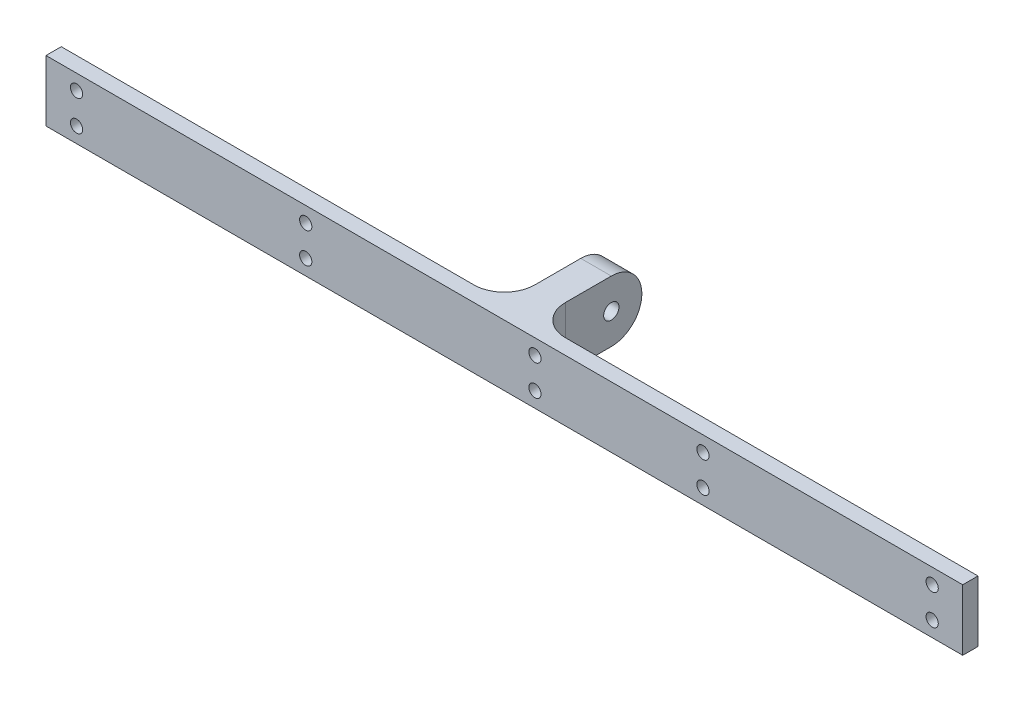
ISO-10303-21;
HEADER;
FILE_DESCRIPTION(('STEP AP214'),'2;1');
FILE_NAME('part.step','',(''),(''),'','','');
FILE_SCHEMA(('AUTOMOTIVE_DESIGN { 1 0 10303 214 1 1 1 1 }'));
ENDSEC;
DATA;
#1=APPLICATION_CONTEXT('core data for automotive mechanical design processes');
#2=APPLICATION_PROTOCOL_DEFINITION('international standard','automotive_design',2000,#1);
#3=PRODUCT_CONTEXT('',#1,'mechanical');
#4=PRODUCT('Part','Part','',(#3));
#5=PRODUCT_RELATED_PRODUCT_CATEGORY('part','',(#4));
#6=PRODUCT_DEFINITION_FORMATION('','',#4);
#7=PRODUCT_DEFINITION_CONTEXT('part definition',#1,'design');
#8=PRODUCT_DEFINITION('design','',#6,#7);
#9=PRODUCT_DEFINITION_SHAPE('','',#8);
#10=(LENGTH_UNIT() NAMED_UNIT(*) SI_UNIT(.MILLI.,.METRE.));
#11=(NAMED_UNIT(*) PLANE_ANGLE_UNIT() SI_UNIT($,.RADIAN.));
#12=(NAMED_UNIT(*) SI_UNIT($,.STERADIAN.) SOLID_ANGLE_UNIT());
#13=UNCERTAINTY_MEASURE_WITH_UNIT(LENGTH_MEASURE(1.E-05),#10,'distance_accuracy_value','');
#14=(GEOMETRIC_REPRESENTATION_CONTEXT(3) GLOBAL_UNCERTAINTY_ASSIGNED_CONTEXT((#13)) GLOBAL_UNIT_ASSIGNED_CONTEXT((#10,
#11,#12)) REPRESENTATION_CONTEXT('',''));
#15=CARTESIAN_POINT('',(0.,0.,0.));
#16=DIRECTION('',(0.,0.,1.));
#17=DIRECTION('',(1.,0.,0.));
#18=AXIS2_PLACEMENT_3D('',#15,#16,#17);
#19=CARTESIAN_POINT('',(30.,0.,-25.));
#20=DIRECTION('',(-1.,0.,0.));
#21=DIRECTION('',(0.,-1.,0.));
#22=AXIS2_PLACEMENT_3D('',#19,#20,#21);
#23=CYLINDRICAL_SURFACE('',#22,1.5);
#24=CARTESIAN_POINT('',(-5.,0.,-25.));
#25=DIRECTION('',(-1.,0.,0.));
#26=DIRECTION('',(0.,-1.,0.));
#27=AXIS2_PLACEMENT_3D('',#24,#25,#26);
#28=CIRCLE('',#27,1.5);
#29=CARTESIAN_POINT('',(-5.,-1.5,-25.));
#30=VERTEX_POINT('',#29);
#31=EDGE_CURVE('E420',#30,#30,#28,.T.);
#32=ORIENTED_EDGE('',*,*,#31,.T.);
#33=EDGE_LOOP('',(#32));
#34=FACE_BOUND('',#33,.T.);
#35=CARTESIAN_POINT('',(0.,0.,-25.));
#36=DIRECTION('',(1.,0.,0.));
#37=DIRECTION('',(0.,1.,0.));
#38=AXIS2_PLACEMENT_3D('',#35,#36,#37);
#39=CIRCLE('',#38,1.5);
#40=CARTESIAN_POINT('',(0.,1.5,-25.));
#41=VERTEX_POINT('',#40);
#42=EDGE_CURVE('E43',#41,#41,#39,.F.);
#43=ORIENTED_EDGE('',*,*,#42,.F.);
#44=EDGE_LOOP('',(#43));
#45=FACE_BOUND('',#44,.T.);
#46=ADVANCED_FACE('F39',(#34,#45),#23,.F.);
#47=CARTESIAN_POINT('',(0.,0.,0.));
#48=DIRECTION('',(0.,0.,1.));
#49=DIRECTION('',(1.,0.,0.));
#50=AXIS2_PLACEMENT_3D('',#47,#48,#49);
#51=PLANE('',#50);
#52=CARTESIAN_POINT('',(140.,-5.,0.));
#53=DIRECTION('',(0.,0.,1.));
#54=DIRECTION('',(1.,0.,0.));
#55=AXIS2_PLACEMENT_3D('',#52,#53,#54);
#56=CIRCLE('',#55,2.);
#57=CARTESIAN_POINT('',(142.,-5.,0.));
#58=VERTEX_POINT('',#57);
#59=EDGE_CURVE('E317',#58,#58,#56,.T.);
#60=ORIENTED_EDGE('',*,*,#59,.T.);
#61=EDGE_LOOP('',(#60));
#62=FACE_BOUND('',#61,.T.);
#63=CARTESIAN_POINT('',(140.,5.,0.));
#64=DIRECTION('',(0.,0.,1.));
#65=DIRECTION('',(1.,0.,0.));
#66=AXIS2_PLACEMENT_3D('',#63,#64,#65);
#67=CIRCLE('',#66,2.);
#68=CARTESIAN_POINT('',(142.,5.,0.));
#69=VERTEX_POINT('',#68);
#70=EDGE_CURVE('E303',#69,#69,#67,.T.);
#71=ORIENTED_EDGE('',*,*,#70,.T.);
#72=EDGE_LOOP('',(#71));
#73=FACE_BOUND('',#72,.T.);
#74=CARTESIAN_POINT('',(65.,-5.,0.));
#75=DIRECTION('',(0.,0.,1.));
#76=DIRECTION('',(1.,0.,0.));
#77=AXIS2_PLACEMENT_3D('',#74,#75,#76);
#78=CIRCLE('',#77,2.);
#79=CARTESIAN_POINT('',(67.,-5.,0.));
#80=VERTEX_POINT('',#79);
#81=EDGE_CURVE('E297',#80,#80,#78,.T.);
#82=ORIENTED_EDGE('',*,*,#81,.T.);
#83=EDGE_LOOP('',(#82));
#84=FACE_BOUND('',#83,.T.);
#85=CARTESIAN_POINT('',(65.,5.,0.));
#86=DIRECTION('',(0.,0.,1.));
#87=DIRECTION('',(1.,0.,0.));
#88=AXIS2_PLACEMENT_3D('',#85,#86,#87);
#89=CIRCLE('',#88,2.);
#90=CARTESIAN_POINT('',(67.,5.,0.));
#91=VERTEX_POINT('',#90);
#92=EDGE_CURVE('E321',#91,#91,#89,.T.);
#93=ORIENTED_EDGE('',*,*,#92,.T.);
#94=EDGE_LOOP('',(#93));
#95=FACE_BOUND('',#94,.T.);
#96=DIRECTION('',(1.,0.,0.));
#97=VECTOR('',#96,1.);
#98=CARTESIAN_POINT('',(-150.,-10.,0.));
#99=LINE('',#98,#97);
#100=CARTESIAN_POINT('',(15.,-10.,0.));
#101=VERTEX_POINT('',#100);
#102=CARTESIAN_POINT('',(150.,-10.,0.));
#103=VERTEX_POINT('',#102);
#104=EDGE_CURVE('E370',#101,#103,#99,.T.);
#105=ORIENTED_EDGE('',*,*,#104,.F.);
#106=DIRECTION('',(0.,-1.,0.));
#107=VECTOR('',#106,1.);
#108=CARTESIAN_POINT('',(15.,10.,0.));
#109=LINE('',#108,#107);
#110=CARTESIAN_POINT('',(15.,10.,0.));
#111=VERTEX_POINT('',#110);
#112=EDGE_CURVE('E168',#101,#111,#109,.F.);
#113=ORIENTED_EDGE('',*,*,#112,.T.);
#114=DIRECTION('',(-1.,0.,0.));
#115=VECTOR('',#114,1.);
#116=CARTESIAN_POINT('',(-150.,10.,0.));
#117=LINE('',#116,#115);
#118=CARTESIAN_POINT('',(150.,10.,0.));
#119=VERTEX_POINT('',#118);
#120=EDGE_CURVE('E145',#119,#111,#117,.T.);
#121=ORIENTED_EDGE('',*,*,#120,.F.);
#122=DIRECTION('',(0.,1.,0.));
#123=VECTOR('',#122,1.);
#124=CARTESIAN_POINT('',(150.,10.,0.));
#125=LINE('',#124,#123);
#126=EDGE_CURVE('E374',#103,#119,#125,.T.);
#127=ORIENTED_EDGE('',*,*,#126,.F.);
#128=EDGE_LOOP('',(#105,#113,#121,#127));
#129=FACE_BOUND('',#128,.T.);
#130=ADVANCED_FACE('F245',(#62,#73,#84,#95,#129),#51,.F.);
#131=CARTESIAN_POINT('',(-140.,5.,0.));
#132=DIRECTION('',(0.,0.,1.));
#133=DIRECTION('',(1.,0.,0.));
#134=AXIS2_PLACEMENT_3D('',#131,#132,#133);
#135=CIRCLE('',#134,2.);
#136=CARTESIAN_POINT('',(-138.,5.,0.));
#137=VERTEX_POINT('',#136);
#138=EDGE_CURVE('E356',#137,#137,#135,.T.);
#139=ORIENTED_EDGE('',*,*,#138,.T.);
#140=EDGE_LOOP('',(#139));
#141=FACE_BOUND('',#140,.T.);
#142=CARTESIAN_POINT('',(-65.,-5.,0.));
#143=DIRECTION('',(0.,0.,1.));
#144=DIRECTION('',(1.,0.,0.));
#145=AXIS2_PLACEMENT_3D('',#142,#143,#144);
#146=CIRCLE('',#145,2.);
#147=CARTESIAN_POINT('',(-63.,-5.,0.));
#148=VERTEX_POINT('',#147);
#149=EDGE_CURVE('E328',#148,#148,#146,.T.);
#150=ORIENTED_EDGE('',*,*,#149,.T.);
#151=EDGE_LOOP('',(#150));
#152=FACE_BOUND('',#151,.T.);
#153=CARTESIAN_POINT('',(-65.,5.,0.));
#154=DIRECTION('',(0.,0.,1.));
#155=DIRECTION('',(1.,0.,0.));
#156=AXIS2_PLACEMENT_3D('',#153,#154,#155);
#157=CIRCLE('',#156,2.);
#158=CARTESIAN_POINT('',(-63.,5.,0.));
#159=VERTEX_POINT('',#158);
#160=EDGE_CURVE('E349',#159,#159,#157,.T.);
#161=ORIENTED_EDGE('',*,*,#160,.T.);
#162=EDGE_LOOP('',(#161));
#163=FACE_BOUND('',#162,.T.);
#164=CARTESIAN_POINT('',(-140.,-5.,0.));
#165=DIRECTION('',(0.,0.,1.));
#166=DIRECTION('',(1.,0.,0.));
#167=AXIS2_PLACEMENT_3D('',#164,#165,#166);
#168=CIRCLE('',#167,2.);
#169=CARTESIAN_POINT('',(-138.,-5.,0.));
#170=VERTEX_POINT('',#169);
#171=EDGE_CURVE('E340',#170,#170,#168,.T.);
#172=ORIENTED_EDGE('',*,*,#171,.T.);
#173=EDGE_LOOP('',(#172));
#174=FACE_BOUND('',#173,.T.);
#175=CARTESIAN_POINT('',(-15.,10.,0.));
#176=VERTEX_POINT('',#175);
#177=CARTESIAN_POINT('',(-150.,10.,0.));
#178=VERTEX_POINT('',#177);
#179=EDGE_CURVE('E377',#176,#178,#117,.T.);
#180=ORIENTED_EDGE('',*,*,#179,.F.);
#181=DIRECTION('',(0.,1.,0.));
#182=VECTOR('',#181,1.);
#183=CARTESIAN_POINT('',(-15.,-10.,0.));
#184=LINE('',#183,#182);
#185=CARTESIAN_POINT('',(-15.,-10.,0.));
#186=VERTEX_POINT('',#185);
#187=EDGE_CURVE('E156',#176,#186,#184,.F.);
#188=ORIENTED_EDGE('',*,*,#187,.T.);
#189=CARTESIAN_POINT('',(-150.,-10.,0.));
#190=VERTEX_POINT('',#189);
#191=EDGE_CURVE('E371',#190,#186,#99,.T.);
#192=ORIENTED_EDGE('',*,*,#191,.F.);
#193=DIRECTION('',(0.,-1.,0.));
#194=VECTOR('',#193,1.);
#195=CARTESIAN_POINT('',(-150.,10.,0.));
#196=LINE('',#195,#194);
#197=EDGE_CURVE('E149',#178,#190,#196,.T.);
#198=ORIENTED_EDGE('',*,*,#197,.F.);
#199=EDGE_LOOP('',(#180,#188,#192,#198));
#200=FACE_BOUND('',#199,.T.);
#201=ADVANCED_FACE('F248',(#141,#152,#163,#174,#200),#51,.F.);
#202=CARTESIAN_POINT('',(-150.,10.,5.));
#203=DIRECTION('',(1.,0.,0.));
#204=DIRECTION('',(0.,0.,-1.));
#205=AXIS2_PLACEMENT_3D('',#202,#203,#204);
#206=PLANE('',#205);
#207=ORIENTED_EDGE('',*,*,#197,.T.);
#208=DIRECTION('',(0.,0.,-1.));
#209=VECTOR('',#208,1.);
#210=CARTESIAN_POINT('',(-150.,-10.,5.));
#211=LINE('',#210,#209);
#212=CARTESIAN_POINT('',(-150.,-10.,5.));
#213=VERTEX_POINT('',#212);
#214=EDGE_CURVE('E127',#213,#190,#211,.T.);
#215=ORIENTED_EDGE('',*,*,#214,.F.);
#216=DIRECTION('',(0.,-1.,0.));
#217=VECTOR('',#216,1.);
#218=CARTESIAN_POINT('',(-150.,10.,5.));
#219=LINE('',#218,#217);
#220=CARTESIAN_POINT('',(-150.,10.,5.));
#221=VERTEX_POINT('',#220);
#222=EDGE_CURVE('E135',#221,#213,#219,.T.);
#223=ORIENTED_EDGE('',*,*,#222,.F.);
#224=DIRECTION('',(0.,0.,-1.));
#225=VECTOR('',#224,1.);
#226=CARTESIAN_POINT('',(-150.,10.,5.));
#227=LINE('',#226,#225);
#228=EDGE_CURVE('E367',#221,#178,#227,.T.);
#229=ORIENTED_EDGE('',*,*,#228,.T.);
#230=EDGE_LOOP('',(#207,#215,#223,#229));
#231=FACE_BOUND('',#230,.T.);
#232=ADVANCED_FACE('F147',(#231),#206,.F.);
#233=CARTESIAN_POINT('',(-150.,-10.,5.));
#234=DIRECTION('',(0.,1.,0.));
#235=DIRECTION('',(0.,0.,1.));
#236=AXIS2_PLACEMENT_3D('',#233,#234,#235);
#237=PLANE('',#236);
#238=DIRECTION('',(0.,0.,1.));
#239=VECTOR('',#238,1.);
#240=CARTESIAN_POINT('',(-5.,-10.,-35.));
#241=LINE('',#240,#239);
#242=CARTESIAN_POINT('',(-5.,-10.,-25.));
#243=VERTEX_POINT('',#242);
#244=CARTESIAN_POINT('',(-5.,-10.,-10.));
#245=VERTEX_POINT('',#244);
#246=EDGE_CURVE('E434',#243,#245,#241,.T.);
#247=ORIENTED_EDGE('',*,*,#246,.F.);
#248=DIRECTION('',(-1.,0.,0.));
#249=VECTOR('',#248,1.);
#250=CARTESIAN_POINT('',(-150.,-10.,-25.));
#251=LINE('',#250,#249);
#252=CARTESIAN_POINT('',(5.,-10.,-25.));
#253=VERTEX_POINT('',#252);
#254=EDGE_CURVE('E410',#243,#253,#251,.F.);
#255=ORIENTED_EDGE('',*,*,#254,.T.);
#256=DIRECTION('',(0.,0.,1.));
#257=VECTOR('',#256,1.);
#258=CARTESIAN_POINT('',(5.,-10.,-35.));
#259=LINE('',#258,#257);
#260=CARTESIAN_POINT('',(5.,-10.,-10.));
#261=VERTEX_POINT('',#260);
#262=EDGE_CURVE('E437',#253,#261,#259,.T.);
#263=ORIENTED_EDGE('',*,*,#262,.T.);
#264=CARTESIAN_POINT('',(15.,-10.,-10.));
#265=DIRECTION('',(0.,1.,0.));
#266=DIRECTION('',(0.,0.,1.));
#267=AXIS2_PLACEMENT_3D('',#264,#265,#266);
#268=CIRCLE('',#267,10.);
#269=EDGE_CURVE('E178',#261,#101,#268,.T.);
#270=ORIENTED_EDGE('',*,*,#269,.T.);
#271=ORIENTED_EDGE('',*,*,#104,.T.);
#272=DIRECTION('',(0.,0.,-1.));
#273=VECTOR('',#272,1.);
#274=CARTESIAN_POINT('',(150.,-10.,5.));
#275=LINE('',#274,#273);
#276=CARTESIAN_POINT('',(150.,-10.,5.));
#277=VERTEX_POINT('',#276);
#278=EDGE_CURVE('E130',#277,#103,#275,.T.);
#279=ORIENTED_EDGE('',*,*,#278,.F.);
#280=DIRECTION('',(1.,0.,0.));
#281=VECTOR('',#280,1.);
#282=CARTESIAN_POINT('',(-150.,-10.,5.));
#283=LINE('',#282,#281);
#284=EDGE_CURVE('E121',#213,#277,#283,.T.);
#285=ORIENTED_EDGE('',*,*,#284,.F.);
#286=ORIENTED_EDGE('',*,*,#214,.T.);
#287=ORIENTED_EDGE('',*,*,#191,.T.);
#288=CARTESIAN_POINT('',(-15.,-10.,-10.));
#289=DIRECTION('',(0.,1.,0.));
#290=DIRECTION('',(0.,0.,1.));
#291=AXIS2_PLACEMENT_3D('',#288,#289,#290);
#292=CIRCLE('',#291,10.);
#293=EDGE_CURVE('E174',#186,#245,#292,.T.);
#294=ORIENTED_EDGE('',*,*,#293,.T.);
#295=EDGE_LOOP('',(#247,#255,#263,#270,#271,#279,#285,#286,#287,#294));
#296=FACE_BOUND('',#295,.T.);
#297=ADVANCED_FACE('F124',(#296),#237,.F.);
#298=CARTESIAN_POINT('',(150.,10.,5.));
#299=DIRECTION('',(-1.,0.,0.));
#300=DIRECTION('',(0.,-1.,0.));
#301=AXIS2_PLACEMENT_3D('',#298,#299,#300);
#302=PLANE('',#301);
#303=ORIENTED_EDGE('',*,*,#126,.T.);
#304=DIRECTION('',(0.,0.,-1.));
#305=VECTOR('',#304,1.);
#306=CARTESIAN_POINT('',(150.,10.,5.));
#307=LINE('',#306,#305);
#308=CARTESIAN_POINT('',(150.,10.,5.));
#309=VERTEX_POINT('',#308);
#310=EDGE_CURVE('E158',#309,#119,#307,.T.);
#311=ORIENTED_EDGE('',*,*,#310,.F.);
#312=DIRECTION('',(0.,1.,0.));
#313=VECTOR('',#312,1.);
#314=CARTESIAN_POINT('',(150.,10.,5.));
#315=LINE('',#314,#313);
#316=EDGE_CURVE('E134',#277,#309,#315,.T.);
#317=ORIENTED_EDGE('',*,*,#316,.F.);
#318=ORIENTED_EDGE('',*,*,#278,.T.);
#319=EDGE_LOOP('',(#303,#311,#317,#318));
#320=FACE_BOUND('',#319,.T.);
#321=ADVANCED_FACE('F252',(#320),#302,.F.);
#322=CARTESIAN_POINT('',(-150.,10.,5.));
#323=DIRECTION('',(0.,-1.,0.));
#324=DIRECTION('',(0.,0.,-1.));
#325=AXIS2_PLACEMENT_3D('',#322,#323,#324);
#326=PLANE('',#325);
#327=DIRECTION('',(0.,0.,1.));
#328=VECTOR('',#327,1.);
#329=CARTESIAN_POINT('',(5.,10.,-35.));
#330=LINE('',#329,#328);
#331=CARTESIAN_POINT('',(5.,10.,-25.));
#332=VERTEX_POINT('',#331);
#333=CARTESIAN_POINT('',(5.,10.,-10.));
#334=VERTEX_POINT('',#333);
#335=EDGE_CURVE('E394',#332,#334,#330,.T.);
#336=ORIENTED_EDGE('',*,*,#335,.F.);
#337=DIRECTION('',(1.,0.,0.));
#338=VECTOR('',#337,1.);
#339=CARTESIAN_POINT('',(-150.,10.,-25.));
#340=LINE('',#339,#338);
#341=CARTESIAN_POINT('',(-5.,10.,-25.));
#342=VERTEX_POINT('',#341);
#343=EDGE_CURVE('E11',#332,#342,#340,.F.);
#344=ORIENTED_EDGE('',*,*,#343,.T.);
#345=DIRECTION('',(0.,0.,1.));
#346=VECTOR('',#345,1.);
#347=CARTESIAN_POINT('',(-5.,10.,-35.));
#348=LINE('',#347,#346);
#349=CARTESIAN_POINT('',(-5.,10.,-10.));
#350=VERTEX_POINT('',#349);
#351=EDGE_CURVE('E398',#342,#350,#348,.T.);
#352=ORIENTED_EDGE('',*,*,#351,.T.);
#353=CARTESIAN_POINT('',(-15.,10.,-10.));
#354=DIRECTION('',(0.,-1.,0.));
#355=DIRECTION('',(0.,0.,-1.));
#356=AXIS2_PLACEMENT_3D('',#353,#354,#355);
#357=CIRCLE('',#356,10.);
#358=EDGE_CURVE('E171',#350,#176,#357,.T.);
#359=ORIENTED_EDGE('',*,*,#358,.T.);
#360=ORIENTED_EDGE('',*,*,#179,.T.);
#361=ORIENTED_EDGE('',*,*,#228,.F.);
#362=DIRECTION('',(-1.,0.,0.));
#363=VECTOR('',#362,1.);
#364=CARTESIAN_POINT('',(-150.,10.,5.));
#365=LINE('',#364,#363);
#366=EDGE_CURVE('E140',#309,#221,#365,.T.);
#367=ORIENTED_EDGE('',*,*,#366,.F.);
#368=ORIENTED_EDGE('',*,*,#310,.T.);
#369=ORIENTED_EDGE('',*,*,#120,.T.);
#370=CARTESIAN_POINT('',(15.,10.,-10.));
#371=DIRECTION('',(0.,-1.,0.));
#372=DIRECTION('',(0.,0.,-1.));
#373=AXIS2_PLACEMENT_3D('',#370,#371,#372);
#374=CIRCLE('',#373,10.);
#375=EDGE_CURVE('E181',#111,#334,#374,.T.);
#376=ORIENTED_EDGE('',*,*,#375,.T.);
#377=EDGE_LOOP('',(#336,#344,#352,#359,#360,#361,#367,#368,#369,#376));
#378=FACE_BOUND('',#377,.T.);
#379=ADVANCED_FACE('F243',(#378),#326,.F.);
#380=CARTESIAN_POINT('',(0.,0.,5.));
#381=DIRECTION('',(0.,0.,1.));
#382=DIRECTION('',(1.,0.,0.));
#383=AXIS2_PLACEMENT_3D('',#380,#381,#382);
#384=PLANE('',#383);
#385=CARTESIAN_POINT('',(10.,-5.,5.));
#386=DIRECTION('',(0.,0.,1.));
#387=DIRECTION('',(1.,0.,0.));
#388=AXIS2_PLACEMENT_3D('',#385,#386,#387);
#389=CIRCLE('',#388,2.);
#390=CARTESIAN_POINT('',(12.,-5.,5.));
#391=VERTEX_POINT('',#390);
#392=EDGE_CURVE('E196',#391,#391,#389,.T.);
#393=ORIENTED_EDGE('',*,*,#392,.F.);
#394=EDGE_LOOP('',(#393));
#395=FACE_BOUND('',#394,.T.);
#396=CARTESIAN_POINT('',(65.,5.,5.));
#397=DIRECTION('',(0.,0.,1.));
#398=DIRECTION('',(1.,0.,0.));
#399=AXIS2_PLACEMENT_3D('',#396,#397,#398);
#400=CIRCLE('',#399,2.);
#401=CARTESIAN_POINT('',(67.,5.,5.));
#402=VERTEX_POINT('',#401);
#403=EDGE_CURVE('E307',#402,#402,#400,.T.);
#404=ORIENTED_EDGE('',*,*,#403,.F.);
#405=EDGE_LOOP('',(#404));
#406=FACE_BOUND('',#405,.T.);
#407=CARTESIAN_POINT('',(65.,-5.,5.));
#408=DIRECTION('',(0.,0.,1.));
#409=DIRECTION('',(1.,0.,0.));
#410=AXIS2_PLACEMENT_3D('',#407,#408,#409);
#411=CIRCLE('',#410,2.);
#412=CARTESIAN_POINT('',(67.,-5.,5.));
#413=VERTEX_POINT('',#412);
#414=EDGE_CURVE('E300',#413,#413,#411,.T.);
#415=ORIENTED_EDGE('',*,*,#414,.F.);
#416=EDGE_LOOP('',(#415));
#417=FACE_BOUND('',#416,.T.);
#418=CARTESIAN_POINT('',(140.,5.,5.));
#419=DIRECTION('',(0.,0.,1.));
#420=DIRECTION('',(1.,0.,0.));
#421=AXIS2_PLACEMENT_3D('',#418,#419,#420);
#422=CIRCLE('',#421,2.);
#423=CARTESIAN_POINT('',(142.,5.,5.));
#424=VERTEX_POINT('',#423);
#425=EDGE_CURVE('E310',#424,#424,#422,.T.);
#426=ORIENTED_EDGE('',*,*,#425,.F.);
#427=EDGE_LOOP('',(#426));
#428=FACE_BOUND('',#427,.T.);
#429=CARTESIAN_POINT('',(-140.,-5.,5.));
#430=DIRECTION('',(0.,0.,1.));
#431=DIRECTION('',(1.,0.,0.));
#432=AXIS2_PLACEMENT_3D('',#429,#430,#431);
#433=CIRCLE('',#432,2.);
#434=CARTESIAN_POINT('',(-138.,-5.,5.));
#435=VERTEX_POINT('',#434);
#436=EDGE_CURVE('E345',#435,#435,#433,.T.);
#437=ORIENTED_EDGE('',*,*,#436,.F.);
#438=EDGE_LOOP('',(#437));
#439=FACE_BOUND('',#438,.T.);
#440=CARTESIAN_POINT('',(-65.,5.,5.));
#441=DIRECTION('',(0.,0.,1.));
#442=DIRECTION('',(1.,0.,0.));
#443=AXIS2_PLACEMENT_3D('',#440,#441,#442);
#444=CIRCLE('',#443,2.);
#445=CARTESIAN_POINT('',(-63.,5.,5.));
#446=VERTEX_POINT('',#445);
#447=EDGE_CURVE('E332',#446,#446,#444,.T.);
#448=ORIENTED_EDGE('',*,*,#447,.F.);
#449=EDGE_LOOP('',(#448));
#450=FACE_BOUND('',#449,.T.);
#451=CARTESIAN_POINT('',(-65.,-5.,5.));
#452=DIRECTION('',(0.,0.,1.));
#453=DIRECTION('',(1.,0.,0.));
#454=AXIS2_PLACEMENT_3D('',#451,#452,#453);
#455=CIRCLE('',#454,2.);
#456=CARTESIAN_POINT('',(-63.,-5.,5.));
#457=VERTEX_POINT('',#456);
#458=EDGE_CURVE('E333',#457,#457,#455,.T.);
#459=ORIENTED_EDGE('',*,*,#458,.F.);
#460=EDGE_LOOP('',(#459));
#461=FACE_BOUND('',#460,.T.);
#462=CARTESIAN_POINT('',(10.,5.,5.));
#463=DIRECTION('',(0.,0.,1.));
#464=DIRECTION('',(1.,0.,0.));
#465=AXIS2_PLACEMENT_3D('',#462,#463,#464);
#466=CIRCLE('',#465,2.);
#467=CARTESIAN_POINT('',(12.,5.,5.));
#468=VERTEX_POINT('',#467);
#469=EDGE_CURVE('E195',#468,#468,#466,.T.);
#470=ORIENTED_EDGE('',*,*,#469,.F.);
#471=EDGE_LOOP('',(#470));
#472=FACE_BOUND('',#471,.T.);
#473=CARTESIAN_POINT('',(140.,-5.,5.));
#474=DIRECTION('',(0.,0.,1.));
#475=DIRECTION('',(1.,0.,0.));
#476=AXIS2_PLACEMENT_3D('',#473,#474,#475);
#477=CIRCLE('',#476,2.);
#478=CARTESIAN_POINT('',(142.,-5.,5.));
#479=VERTEX_POINT('',#478);
#480=EDGE_CURVE('E440',#479,#479,#477,.T.);
#481=ORIENTED_EDGE('',*,*,#480,.F.);
#482=EDGE_LOOP('',(#481));
#483=FACE_BOUND('',#482,.T.);
#484=CARTESIAN_POINT('',(-140.,5.,5.));
#485=DIRECTION('',(0.,0.,1.));
#486=DIRECTION('',(1.,0.,0.));
#487=AXIS2_PLACEMENT_3D('',#484,#485,#486);
#488=CIRCLE('',#487,2.);
#489=CARTESIAN_POINT('',(-138.,5.,5.));
#490=VERTEX_POINT('',#489);
#491=EDGE_CURVE('E344',#490,#490,#488,.T.);
#492=ORIENTED_EDGE('',*,*,#491,.F.);
#493=EDGE_LOOP('',(#492));
#494=FACE_BOUND('',#493,.T.);
#495=ORIENTED_EDGE('',*,*,#222,.T.);
#496=ORIENTED_EDGE('',*,*,#284,.T.);
#497=ORIENTED_EDGE('',*,*,#316,.T.);
#498=ORIENTED_EDGE('',*,*,#366,.T.);
#499=EDGE_LOOP('',(#495,#496,#497,#498));
#500=FACE_BOUND('',#499,.T.);
#501=ADVANCED_FACE('F138',(#395,#406,#417,#428,#439,#450,#461,#472,#483,#494,#500),#384,.T.);
#502=CARTESIAN_POINT('',(-140.,5.,0.));
#503=DIRECTION('',(0.,0.,1.));
#504=DIRECTION('',(1.,0.,0.));
#505=AXIS2_PLACEMENT_3D('',#502,#503,#504);
#506=CYLINDRICAL_SURFACE('',#505,2.);
#507=ORIENTED_EDGE('',*,*,#138,.F.);
#508=EDGE_LOOP('',(#507));
#509=FACE_BOUND('',#508,.T.);
#510=ORIENTED_EDGE('',*,*,#491,.T.);
#511=EDGE_LOOP('',(#510));
#512=FACE_BOUND('',#511,.T.);
#513=ADVANCED_FACE('F237',(#509,#512),#506,.F.);
#514=CARTESIAN_POINT('',(140.,-5.,0.));
#515=DIRECTION('',(0.,0.,1.));
#516=DIRECTION('',(1.,0.,0.));
#517=AXIS2_PLACEMENT_3D('',#514,#515,#516);
#518=CYLINDRICAL_SURFACE('',#517,2.);
#519=ORIENTED_EDGE('',*,*,#59,.F.);
#520=EDGE_LOOP('',(#519));
#521=FACE_BOUND('',#520,.T.);
#522=ORIENTED_EDGE('',*,*,#480,.T.);
#523=EDGE_LOOP('',(#522));
#524=FACE_BOUND('',#523,.T.);
#525=ADVANCED_FACE('F228',(#521,#524),#518,.F.);
#526=CARTESIAN_POINT('',(10.,5.,0.));
#527=DIRECTION('',(0.,0.,1.));
#528=DIRECTION('',(1.,0.,0.));
#529=AXIS2_PLACEMENT_3D('',#526,#527,#528);
#530=CYLINDRICAL_SURFACE('',#529,2.);
#531=CARTESIAN_POINT('',(8.00000000000001,5.,-2.85857157145714));
#532=CARTESIAN_POINT('',(8.00000043627819,4.90826293230523,-2.85857098601314));
#533=CARTESIAN_POINT('',(8.00636263854907,4.81652297099194,-2.85231830835913));
#534=CARTESIAN_POINT('',(8.03123908586403,4.63630252842376,-2.82806457494921));
#535=CARTESIAN_POINT('',(8.04976324518671,4.54782476867757,-2.8100539343135));
#536=CARTESIAN_POINT('',(8.09736313389133,4.37729609835461,-2.76434754097577));
#537=CARTESIAN_POINT('',(8.12635428674192,4.29519990833784,-2.73672948265461));
#538=CARTESIAN_POINT('',(8.19331808635749,4.13789595360876,-2.67393756357716));
#539=CARTESIAN_POINT('',(8.23129692555304,4.06269298804547,-2.63875849489719));
#540=CARTESIAN_POINT('',(8.33327996274917,3.88811024006046,-2.54604661727928));
#541=CARTESIAN_POINT('',(8.40137113455229,3.79271681831479,-2.48550216466898));
#542=CARTESIAN_POINT('',(8.55006144622624,3.61764289642904,-2.35748993668564));
#543=CARTESIAN_POINT('',(8.63068043840066,3.53798779924581,-2.29001123139637));
#544=CARTESIAN_POINT('',(8.80395985667537,3.39298394941313,-2.15004852505579));
#545=CARTESIAN_POINT('',(8.89683479842568,3.32796506997267,-2.07748987856797));
#546=CARTESIAN_POINT('',(9.09146420320022,3.21471528975563,-1.93129255872878));
#547=CARTESIAN_POINT('',(9.19321808844271,3.16648329761912,-1.85765395591272));
#548=CARTESIAN_POINT('',(9.42290667533596,3.08047910850628,-1.69826221273849));
#549=CARTESIAN_POINT('',(9.55227060161669,3.04611605830144,-1.6126956316572));
#550=CARTESIAN_POINT('',(9.81809186578719,3.00375019953935,-1.44591109871446));
#551=CARTESIAN_POINT('',(9.95455155932262,2.99575620244019,-1.36469460939239));
#552=CARTESIAN_POINT('',(10.2257539930332,3.00830696203903,-1.21194093983877));
#553=CARTESIAN_POINT('',(10.3604056243839,3.02792186611895,-1.14017328483367));
#554=CARTESIAN_POINT('',(10.6269500739079,3.09585202254956,-1.00563273028355));
#555=CARTESIAN_POINT('',(10.7588460646395,3.14413214583932,-0.942848937744068));
#556=CARTESIAN_POINT('',(10.9960714002976,3.26134121246653,-0.835764151504117));
#557=CARTESIAN_POINT('',(11.1025905467911,3.32662941298377,-0.790113471763075));
#558=CARTESIAN_POINT('',(11.3035876573943,3.47801356194205,-0.707619893833539));
#559=CARTESIAN_POINT('',(11.3980752680141,3.56409267839678,-0.67076991849141));
#560=CARTESIAN_POINT('',(11.5600255988331,3.74335074326903,-0.60994159163768));
#561=CARTESIAN_POINT('',(11.6293593546972,3.8345062906607,-0.584959470136185));
#562=CARTESIAN_POINT('',(11.7519610014264,4.0285162498548,-0.541962354957508));
#563=CARTESIAN_POINT('',(11.8052349697709,4.13136621581417,-0.523944724988758));
#564=CARTESIAN_POINT('',(11.8908468438419,4.33924703394421,-0.495522576170452));
#565=CARTESIAN_POINT('',(11.9242283048435,4.44379724961529,-0.484733934623929));
#566=CARTESIAN_POINT('',(11.9734746986493,4.65736388919085,-0.468954837553544));
#567=CARTESIAN_POINT('',(11.9893422055517,4.76637965433178,-0.463963529965928));
#568=CARTESIAN_POINT('',(12.0028269254919,4.98343977676192,-0.459716900795395));
#569=CARTESIAN_POINT('',(12.0008036042222,5.09145980043603,-0.460348602443895));
#570=CARTESIAN_POINT('',(11.9794409665108,5.30559580946559,-0.467091407047799));
#571=CARTESIAN_POINT('',(11.9601025153576,5.41171188969647,-0.473202236194935));
#572=CARTESIAN_POINT('',(11.9048915072422,5.61873524303283,-0.490997236561004));
#573=CARTESIAN_POINT('',(11.8690654849474,5.71965629312284,-0.502665725011206));
#574=CARTESIAN_POINT('',(11.7822019075111,5.91382049849634,-0.531744531953491));
#575=CARTESIAN_POINT('',(11.7311645810278,6.00706376916621,-0.549154764135443));
#576=CARTESIAN_POINT('',(11.615163428294,6.18430336668344,-0.590075126759098));
#577=CARTESIAN_POINT('',(11.5500671742329,6.26819938979152,-0.613643742709495));
#578=CARTESIAN_POINT('',(11.4086312578889,6.42365937113798,-0.666845786988882));
#579=CARTESIAN_POINT('',(11.3322907161332,6.49522236379658,-0.696479689785394));
#580=CARTESIAN_POINT('',(11.1684246168021,6.62670554676969,-0.76273455951202));
#581=CARTESIAN_POINT('',(11.0806180485967,6.68617662379622,-0.799549789191217));
#582=CARTESIAN_POINT('',(10.8988519923766,6.78969713166381,-0.879121132838461));
#583=CARTESIAN_POINT('',(10.8048909258131,6.8337425875026,-0.921878774137413));
#584=CARTESIAN_POINT('',(10.6068910036624,6.9088398973011,-1.0159352081166));
#585=CARTESIAN_POINT('',(10.5026086206279,6.93875710844408,-1.06762359352745));
#586=CARTESIAN_POINT('',(10.2932309543131,6.98127342529382,-1.17615409177289));
#587=CARTESIAN_POINT('',(10.1881353678982,6.9938657257934,-1.23299822043844));
#588=CARTESIAN_POINT('',(9.9677353318687,7.00311367217624,-1.35742687433164));
#589=CARTESIAN_POINT('',(9.85262464239278,6.99780022207651,-1.42549837601087));
#590=CARTESIAN_POINT('',(9.62698807742246,6.96820495999234,-1.56504979484184));
#591=CARTESIAN_POINT('',(9.51646533646376,6.94391039743295,-1.63653197279953));
#592=CARTESIAN_POINT('',(9.28820843681968,6.87334054694543,-1.79044954520936));
#593=CARTESIAN_POINT('',(9.17137372637869,6.82464105023783,-1.87311169858175));
#594=CARTESIAN_POINT('',(8.94842661157315,6.70591828947744,-2.03773493635672));
#595=CARTESIAN_POINT('',(8.84231847112405,6.63588658971428,-2.11969573020438));
#596=CARTESIAN_POINT('',(8.65544103709797,6.48485559195646,-2.26959588810014));
#597=CARTESIAN_POINT('',(8.57315941742862,6.40621938062906,-2.33802962475815));
#598=CARTESIAN_POINT('',(8.42106520655675,6.23296884337128,-2.46822801209307));
#599=CARTESIAN_POINT('',(8.35123315664324,6.13837991006721,-2.53000300956046));
#600=CARTESIAN_POINT('',(8.24304528386467,5.95971431899071,-2.62792620868601));
#601=CARTESIAN_POINT('',(8.20120668178974,5.87913322699311,-2.66658832149108));
#602=CARTESIAN_POINT('',(8.12795681881247,5.70987887224087,-2.73518475178508));
#603=CARTESIAN_POINT('',(8.09653361556434,5.62121502704674,-2.76512906032169));
#604=CARTESIAN_POINT('',(8.04815617124063,5.44492075618619,-2.81161249414888));
#605=CARTESIAN_POINT('',(8.03022693537538,5.35780151865023,-2.82904934347482));
#606=CARTESIAN_POINT('',(8.00615338782204,5.18045407550935,-2.85252457329904));
#607=CARTESIAN_POINT('',(7.99999957089649,5.09022843736921,-2.85857214727343));
#608=CARTESIAN_POINT('',(8.00000000000001,5.,-2.85857157145714));
#609=B_SPLINE_CURVE_WITH_KNOTS('',3,(#531,#532,#533,#534,#535,#536,#537,#538,#539,#540,#541,
#542,#543,#544,#545,#546,#547,#548,#549,#550,#551,#552,#553,#554,#555,#556,#557,#558,#559,#560,
#561,#562,#563,#564,#565,#566,#567,#568,#569,#570,#571,#572,#573,#574,#575,#576,#577,#578,#579,
#580,#581,#582,#583,#584,#585,#586,#587,#588,#589,#590,#591,#592,#593,#594,#595,#596,#597,#598,
#599,#600,#601,#602,#603,#604,#605,#606,#607,#608),.UNSPECIFIED.,.T.,.F.,(4,2,2,2,2,2,2,2,2,2,2,
2,2,2,2,2,2,2,2,2,2,2,2,2,2,2,2,2,2,2,2,2,2,2,2,2,2,2,4),(0.,0.274810480616509,
0.549845261992414,0.822705669898175,1.09575462620715,1.48936565003062,1.88360689564485,
2.28599998656839,2.68836691196411,3.16263326071349,3.63705807381619,4.09588141688724,
4.55414363183481,4.95090482768136,5.34734588249324,5.69719436538621,6.04691028900736,
6.37614136384647,6.70532404378895,7.02790799250085,7.35047582163347,7.67213876378794,
7.99379687091208,8.31862837806938,8.64348530545008,8.97880293930882,9.31420691713441,
9.67325123313968,10.0324365411589,10.4323524674201,10.8325372686925,11.284167267484,
11.7359760934088,12.1329434715275,12.5292848424416,12.8242912030836,13.1189581283695,
13.3894677583326,13.6597589379157),.UNSPECIFIED.);
#610=CARTESIAN_POINT('',(8.00000000000001,5.,-2.85857157145714));
#611=VERTEX_POINT('',#610);
#612=EDGE_CURVE('E197',#611,#611,#609,.T.);
#613=ORIENTED_EDGE('',*,*,#612,.F.);
#614=EDGE_LOOP('',(#613));
#615=FACE_BOUND('',#614,.T.);
#616=ORIENTED_EDGE('',*,*,#469,.T.);
#617=EDGE_LOOP('',(#616));
#618=FACE_BOUND('',#617,.T.);
#619=ADVANCED_FACE('F223',(#615,#618),#530,.F.);
#620=CARTESIAN_POINT('',(-65.,-5.,0.));
#621=DIRECTION('',(0.,0.,1.));
#622=DIRECTION('',(1.,0.,0.));
#623=AXIS2_PLACEMENT_3D('',#620,#621,#622);
#624=CYLINDRICAL_SURFACE('',#623,2.);
#625=ORIENTED_EDGE('',*,*,#149,.F.);
#626=EDGE_LOOP('',(#625));
#627=FACE_BOUND('',#626,.T.);
#628=ORIENTED_EDGE('',*,*,#458,.T.);
#629=EDGE_LOOP('',(#628));
#630=FACE_BOUND('',#629,.T.);
#631=ADVANCED_FACE('F220',(#627,#630),#624,.F.);
#632=CARTESIAN_POINT('',(-65.,5.,0.));
#633=DIRECTION('',(0.,0.,1.));
#634=DIRECTION('',(1.,0.,0.));
#635=AXIS2_PLACEMENT_3D('',#632,#633,#634);
#636=CYLINDRICAL_SURFACE('',#635,2.);
#637=ORIENTED_EDGE('',*,*,#160,.F.);
#638=EDGE_LOOP('',(#637));
#639=FACE_BOUND('',#638,.T.);
#640=ORIENTED_EDGE('',*,*,#447,.T.);
#641=EDGE_LOOP('',(#640));
#642=FACE_BOUND('',#641,.T.);
#643=ADVANCED_FACE('F222',(#639,#642),#636,.F.);
#644=CARTESIAN_POINT('',(-140.,-5.,0.));
#645=DIRECTION('',(0.,0.,1.));
#646=DIRECTION('',(1.,0.,0.));
#647=AXIS2_PLACEMENT_3D('',#644,#645,#646);
#648=CYLINDRICAL_SURFACE('',#647,2.);
#649=ORIENTED_EDGE('',*,*,#171,.F.);
#650=EDGE_LOOP('',(#649));
#651=FACE_BOUND('',#650,.T.);
#652=ORIENTED_EDGE('',*,*,#436,.T.);
#653=EDGE_LOOP('',(#652));
#654=FACE_BOUND('',#653,.T.);
#655=ADVANCED_FACE('F230',(#651,#654),#648,.F.);
#656=CARTESIAN_POINT('',(140.,5.,0.));
#657=DIRECTION('',(0.,0.,1.));
#658=DIRECTION('',(1.,0.,0.));
#659=AXIS2_PLACEMENT_3D('',#656,#657,#658);
#660=CYLINDRICAL_SURFACE('',#659,2.);
#661=ORIENTED_EDGE('',*,*,#70,.F.);
#662=EDGE_LOOP('',(#661));
#663=FACE_BOUND('',#662,.T.);
#664=ORIENTED_EDGE('',*,*,#425,.T.);
#665=EDGE_LOOP('',(#664));
#666=FACE_BOUND('',#665,.T.);
#667=ADVANCED_FACE('F214',(#663,#666),#660,.F.);
#668=CARTESIAN_POINT('',(65.,-5.,0.));
#669=DIRECTION('',(0.,0.,1.));
#670=DIRECTION('',(1.,0.,0.));
#671=AXIS2_PLACEMENT_3D('',#668,#669,#670);
#672=CYLINDRICAL_SURFACE('',#671,2.);
#673=ORIENTED_EDGE('',*,*,#81,.F.);
#674=EDGE_LOOP('',(#673));
#675=FACE_BOUND('',#674,.T.);
#676=ORIENTED_EDGE('',*,*,#414,.T.);
#677=EDGE_LOOP('',(#676));
#678=FACE_BOUND('',#677,.T.);
#679=ADVANCED_FACE('F218',(#675,#678),#672,.F.);
#680=CARTESIAN_POINT('',(65.,5.,0.));
#681=DIRECTION('',(0.,0.,1.));
#682=DIRECTION('',(1.,0.,0.));
#683=AXIS2_PLACEMENT_3D('',#680,#681,#682);
#684=CYLINDRICAL_SURFACE('',#683,2.);
#685=ORIENTED_EDGE('',*,*,#92,.F.);
#686=EDGE_LOOP('',(#685));
#687=FACE_BOUND('',#686,.T.);
#688=ORIENTED_EDGE('',*,*,#403,.T.);
#689=EDGE_LOOP('',(#688));
#690=FACE_BOUND('',#689,.T.);
#691=ADVANCED_FACE('F212',(#687,#690),#684,.F.);
#692=CARTESIAN_POINT('',(10.,-5.,0.));
#693=DIRECTION('',(0.,0.,1.));
#694=DIRECTION('',(1.,0.,0.));
#695=AXIS2_PLACEMENT_3D('',#692,#693,#694);
#696=CYLINDRICAL_SURFACE('',#695,2.);
#697=CARTESIAN_POINT('',(8.00000000000001,-5.,-2.85857157145715));
#698=CARTESIAN_POINT('',(8.00000043627819,-5.09173706769476,-2.85857098601315));
#699=CARTESIAN_POINT('',(8.00636263854907,-5.18347702900806,-2.85231830835913));
#700=CARTESIAN_POINT('',(8.03123908586403,-5.36369747157624,-2.82806457494921));
#701=CARTESIAN_POINT('',(8.04976324518671,-5.45217523132242,-2.81005393431351));
#702=CARTESIAN_POINT('',(8.09736313389133,-5.62270390164538,-2.76434754097577));
#703=CARTESIAN_POINT('',(8.12635428674192,-5.70480009166216,-2.73672948265461));
#704=CARTESIAN_POINT('',(8.19331808635749,-5.86210404639124,-2.67393756357716));
#705=CARTESIAN_POINT('',(8.23129692555304,-5.93730701195453,-2.63875849489719));
#706=CARTESIAN_POINT('',(8.33327996274917,-6.11188975993954,-2.54604661727928));
#707=CARTESIAN_POINT('',(8.40137113455229,-6.20728318168521,-2.48550216466898));
#708=CARTESIAN_POINT('',(8.55006144622624,-6.38235710357096,-2.35748993668565));
#709=CARTESIAN_POINT('',(8.63068043840066,-6.46201220075419,-2.29001123139637));
#710=CARTESIAN_POINT('',(8.80395985667537,-6.60701605058686,-2.15004852505579));
#711=CARTESIAN_POINT('',(8.89683479842568,-6.67203493002733,-2.07748987856798));
#712=CARTESIAN_POINT('',(9.09146420320022,-6.78528471024437,-1.93129255872878));
#713=CARTESIAN_POINT('',(9.19321808844271,-6.83351670238088,-1.85765395591272));
#714=CARTESIAN_POINT('',(9.42290667533596,-6.91952089149372,-1.69826221273849));
#715=CARTESIAN_POINT('',(9.55227060161668,-6.95388394169856,-1.6126956316572));
#716=CARTESIAN_POINT('',(9.81809186578718,-6.99624980046065,-1.44591109871447));
#717=CARTESIAN_POINT('',(9.95455155932261,-7.00424379755981,-1.36469460939239));
#718=CARTESIAN_POINT('',(10.2257539930332,-6.99169303796097,-1.21194093983877));
#719=CARTESIAN_POINT('',(10.3604056243839,-6.97207813388105,-1.14017328483367));
#720=CARTESIAN_POINT('',(10.6269500739079,-6.90414797745044,-1.00563273028355));
#721=CARTESIAN_POINT('',(10.7588460646395,-6.85586785416068,-0.94284893774407));
#722=CARTESIAN_POINT('',(10.9960714002976,-6.73865878753347,-0.835764151504119));
#723=CARTESIAN_POINT('',(11.1025905467911,-6.67337058701624,-0.790113471763077));
#724=CARTESIAN_POINT('',(11.3035876573943,-6.52198643805795,-0.70761989383354));
#725=CARTESIAN_POINT('',(11.3980752680141,-6.43590732160322,-0.67076991849141));
#726=CARTESIAN_POINT('',(11.5600255988331,-6.25664925673097,-0.609941591637681));
#727=CARTESIAN_POINT('',(11.6293593546972,-6.1654937093393,-0.584959470136187));
#728=CARTESIAN_POINT('',(11.7519610014264,-5.9714837501452,-0.54196235495751));
#729=CARTESIAN_POINT('',(11.8052349697709,-5.86863378418583,-0.523944724988759));
#730=CARTESIAN_POINT('',(11.8908468438419,-5.66075296605579,-0.495522576170453));
#731=CARTESIAN_POINT('',(11.9242283048435,-5.55620275038471,-0.48473393462393));
#732=CARTESIAN_POINT('',(11.9734746986493,-5.34263611080916,-0.468954837553546));
#733=CARTESIAN_POINT('',(11.9893422055517,-5.23362034566822,-0.46396352996593));
#734=CARTESIAN_POINT('',(12.0028269254919,-5.01656022323808,-0.459716900795397));
#735=CARTESIAN_POINT('',(12.0008036042222,-4.90854019956397,-0.460348602443896));
#736=CARTESIAN_POINT('',(11.9794409665108,-4.69440419053441,-0.4670914070478));
#737=CARTESIAN_POINT('',(11.9601025153576,-4.58828811030353,-0.473202236194934));
#738=CARTESIAN_POINT('',(11.9048915072422,-4.38126475696717,-0.490997236561003));
#739=CARTESIAN_POINT('',(11.8690654849474,-4.28034370687716,-0.502665725011207));
#740=CARTESIAN_POINT('',(11.7822019075111,-4.08617950150366,-0.531744531953491));
#741=CARTESIAN_POINT('',(11.7311645810278,-3.9929362308338,-0.549154764135441));
#742=CARTESIAN_POINT('',(11.615163428294,-3.81569663331656,-0.590075126759096));
#743=CARTESIAN_POINT('',(11.5500671742329,-3.73180061020848,-0.613643742709496));
#744=CARTESIAN_POINT('',(11.4086312578889,-3.57634062886202,-0.666845786988885));
#745=CARTESIAN_POINT('',(11.3322907161332,-3.50477763620342,-0.696479689785396));
#746=CARTESIAN_POINT('',(11.1684246168021,-3.37329445323031,-0.762734559512021));
#747=CARTESIAN_POINT('',(11.0806180485967,-3.31382337620378,-0.799549789191219));
#748=CARTESIAN_POINT('',(10.8988519923766,-3.21030286833619,-0.879121132838463));
#749=CARTESIAN_POINT('',(10.8048909258131,-3.1662574124974,-0.921878774137415));
#750=CARTESIAN_POINT('',(10.6068910036624,-3.0911601026989,-1.0159352081166));
#751=CARTESIAN_POINT('',(10.5026086206279,-3.06124289155592,-1.06762359352745));
#752=CARTESIAN_POINT('',(10.2932309543131,-3.01872657470618,-1.1761540917729));
#753=CARTESIAN_POINT('',(10.1881353678982,-3.0061342742066,-1.23299822043844));
#754=CARTESIAN_POINT('',(9.9677353318687,-2.99688632782376,-1.35742687433164));
#755=CARTESIAN_POINT('',(9.85262464239278,-3.00219977792349,-1.42549837601087));
#756=CARTESIAN_POINT('',(9.62698807742246,-3.03179504000766,-1.56504979484184));
#757=CARTESIAN_POINT('',(9.51646533646376,-3.05608960256705,-1.63653197279953));
#758=CARTESIAN_POINT('',(9.28820843681969,-3.12665945305457,-1.79044954520936));
#759=CARTESIAN_POINT('',(9.17137372637869,-3.17535894976217,-1.87311169858175));
#760=CARTESIAN_POINT('',(8.94842661157315,-3.29408171052256,-2.03773493635672));
#761=CARTESIAN_POINT('',(8.84231847112405,-3.36411341028572,-2.11969573020438));
#762=CARTESIAN_POINT('',(8.65544103709798,-3.51514440804354,-2.26959588810014));
#763=CARTESIAN_POINT('',(8.57315941742862,-3.59378061937094,-2.33802962475815));
#764=CARTESIAN_POINT('',(8.42106520655675,-3.76703115662872,-2.46822801209307));
#765=CARTESIAN_POINT('',(8.35123315664324,-3.86162008993279,-2.53000300956046));
#766=CARTESIAN_POINT('',(8.24304528386467,-4.04028568100928,-2.62792620868601));
#767=CARTESIAN_POINT('',(8.20120668178975,-4.12086677300689,-2.66658832149108));
#768=CARTESIAN_POINT('',(8.12795681881247,-4.29012112775913,-2.73518475178509));
#769=CARTESIAN_POINT('',(8.09653361556434,-4.37878497295325,-2.76512906032169));
#770=CARTESIAN_POINT('',(8.04815617124063,-4.5550792438138,-2.81161249414888));
#771=CARTESIAN_POINT('',(8.03022693537538,-4.64219848134976,-2.82904934347482));
#772=CARTESIAN_POINT('',(8.00615338782204,-4.81954592449065,-2.85252457329905));
#773=CARTESIAN_POINT('',(7.99999957089649,-4.90977156263079,-2.85857214727343));
#774=CARTESIAN_POINT('',(8.00000000000001,-5.,-2.85857157145715));
#775=B_SPLINE_CURVE_WITH_KNOTS('',3,(#697,#698,#699,#700,#701,#702,#703,#704,#705,#706,#707,
#708,#709,#710,#711,#712,#713,#714,#715,#716,#717,#718,#719,#720,#721,#722,#723,#724,#725,#726,
#727,#728,#729,#730,#731,#732,#733,#734,#735,#736,#737,#738,#739,#740,#741,#742,#743,#744,#745,
#746,#747,#748,#749,#750,#751,#752,#753,#754,#755,#756,#757,#758,#759,#760,#761,#762,#763,#764,
#765,#766,#767,#768,#769,#770,#771,#772,#773,#774),.UNSPECIFIED.,.T.,.F.,(4,2,2,2,2,2,2,2,2,2,2,
2,2,2,2,2,2,2,2,2,2,2,2,2,2,2,2,2,2,2,2,2,2,2,2,2,2,2,4),(0.,0.274810480616508,
0.549845261992414,0.822705669898176,1.09575462620715,1.48936565003062,1.88360689564485,
2.28599998656839,2.6883669119641,3.16263326071349,3.63705807381619,4.09588141688724,
4.55414363183481,4.95090482768136,5.34734588249324,5.69719436538621,6.04691028900736,
6.37614136384647,6.70532404378895,7.02790799250085,7.35047582163346,7.67213876378794,
7.99379687091207,8.31862837806937,8.64348530545007,8.97880293930882,9.3142069171344,
9.67325123313968,10.0324365411589,10.4323524674201,10.8325372686925,11.284167267484,
11.7359760934088,12.1329434715275,12.5292848424416,12.8242912030836,13.1189581283695,
13.3894677583326,13.6597589379157),.UNSPECIFIED.);
#776=CARTESIAN_POINT('',(8.00000000000001,-5.,-2.85857157145715));
#777=VERTEX_POINT('',#776);
#778=EDGE_CURVE('E186',#777,#777,#775,.T.);
#779=ORIENTED_EDGE('',*,*,#778,.F.);
#780=EDGE_LOOP('',(#779));
#781=FACE_BOUND('',#780,.T.);
#782=ORIENTED_EDGE('',*,*,#392,.T.);
#783=EDGE_LOOP('',(#782));
#784=FACE_BOUND('',#783,.T.);
#785=ADVANCED_FACE('F206',(#781,#784),#696,.F.);
#786=CARTESIAN_POINT('',(5.,-10.,-35.));
#787=DIRECTION('',(-1.,0.,0.));
#788=DIRECTION('',(0.,-1.,0.));
#789=AXIS2_PLACEMENT_3D('',#786,#787,#788);
#790=PLANE('',#789);
#791=CARTESIAN_POINT('',(5.,0.,-25.));
#792=DIRECTION('',(1.,0.,0.));
#793=DIRECTION('',(0.,1.,0.));
#794=AXIS2_PLACEMENT_3D('',#791,#792,#793);
#795=CIRCLE('',#794,2.5);
#796=CARTESIAN_POINT('',(5.,2.5,-25.));
#797=VERTEX_POINT('',#796);
#798=EDGE_CURVE('E429',#797,#797,#795,.T.);
#799=ORIENTED_EDGE('',*,*,#798,.F.);
#800=EDGE_LOOP('',(#799));
#801=FACE_BOUND('',#800,.T.);
#802=ORIENTED_EDGE('',*,*,#262,.F.);
#803=CARTESIAN_POINT('',(5.,0.,-25.));
#804=DIRECTION('',(-1.,0.,0.));
#805=DIRECTION('',(0.,-1.,0.));
#806=AXIS2_PLACEMENT_3D('',#803,#804,#805);
#807=CIRCLE('',#806,10.);
#808=CARTESIAN_POINT('',(5.,0.,-35.));
#809=VERTEX_POINT('',#808);
#810=EDGE_CURVE('E49',#253,#809,#807,.F.);
#811=ORIENTED_EDGE('',*,*,#810,.T.);
#812=CARTESIAN_POINT('',(5.,0.,-25.));
#813=DIRECTION('',(-1.,0.,0.));
#814=DIRECTION('',(0.,-1.,0.));
#815=AXIS2_PLACEMENT_3D('',#812,#813,#814);
#816=CIRCLE('',#815,10.);
#817=EDGE_CURVE('E60',#809,#332,#816,.F.);
#818=ORIENTED_EDGE('',*,*,#817,.T.);
#819=ORIENTED_EDGE('',*,*,#335,.T.);
#820=DIRECTION('',(0.,-1.,0.));
#821=VECTOR('',#820,1.);
#822=CARTESIAN_POINT('',(5.,-10.,-10.));
#823=LINE('',#822,#821);
#824=EDGE_CURVE('E164',#334,#261,#823,.T.);
#825=ORIENTED_EDGE('',*,*,#824,.T.);
#826=EDGE_LOOP('',(#802,#811,#818,#819,#825));
#827=FACE_BOUND('',#826,.T.);
#828=ADVANCED_FACE('F211',(#801,#827),#790,.F.);
#829=CARTESIAN_POINT('',(-5.,-10.,-35.));
#830=DIRECTION('',(1.,0.,0.));
#831=DIRECTION('',(0.,1.,0.));
#832=AXIS2_PLACEMENT_3D('',#829,#830,#831);
#833=PLANE('',#832);
#834=ORIENTED_EDGE('',*,*,#31,.F.);
#835=EDGE_LOOP('',(#834));
#836=FACE_BOUND('',#835,.T.);
#837=CARTESIAN_POINT('',(-5.,0.,-25.));
#838=DIRECTION('',(1.,0.,0.));
#839=DIRECTION('',(0.,1.,0.));
#840=AXIS2_PLACEMENT_3D('',#837,#838,#839);
#841=CIRCLE('',#840,10.);
#842=CARTESIAN_POINT('',(-5.,0.,-35.));
#843=VERTEX_POINT('',#842);
#844=EDGE_CURVE('E185',#342,#843,#841,.F.);
#845=ORIENTED_EDGE('',*,*,#844,.T.);
#846=CARTESIAN_POINT('',(-5.,0.,-25.));
#847=DIRECTION('',(1.,0.,0.));
#848=DIRECTION('',(0.,1.,0.));
#849=AXIS2_PLACEMENT_3D('',#846,#847,#848);
#850=CIRCLE('',#849,10.);
#851=EDGE_CURVE('E408',#843,#243,#850,.F.);
#852=ORIENTED_EDGE('',*,*,#851,.T.);
#853=ORIENTED_EDGE('',*,*,#246,.T.);
#854=DIRECTION('',(0.,1.,0.));
#855=VECTOR('',#854,1.);
#856=CARTESIAN_POINT('',(-5.,10.,-10.));
#857=LINE('',#856,#855);
#858=EDGE_CURVE('E151',#245,#350,#857,.T.);
#859=ORIENTED_EDGE('',*,*,#858,.T.);
#860=ORIENTED_EDGE('',*,*,#351,.F.);
#861=EDGE_LOOP('',(#845,#852,#853,#859,#860));
#862=FACE_BOUND('',#861,.T.);
#863=ADVANCED_FACE('F262',(#836,#862),#833,.F.);
#864=CARTESIAN_POINT('',(-15.,-10.,-10.));
#865=DIRECTION('',(0.,-1.,0.));
#866=DIRECTION('',(1.,0.,0.));
#867=AXIS2_PLACEMENT_3D('',#864,#865,#866);
#868=CYLINDRICAL_SURFACE('',#867,10.);
#869=ORIENTED_EDGE('',*,*,#293,.F.);
#870=ORIENTED_EDGE('',*,*,#187,.F.);
#871=ORIENTED_EDGE('',*,*,#358,.F.);
#872=ORIENTED_EDGE('',*,*,#858,.F.);
#873=EDGE_LOOP('',(#869,#870,#871,#872));
#874=FACE_BOUND('',#873,.T.);
#875=ADVANCED_FACE('F260',(#874),#868,.F.);
#876=CARTESIAN_POINT('',(15.,-10.,-10.));
#877=DIRECTION('',(0.,1.,0.));
#878=DIRECTION('',(-1.,0.,0.));
#879=AXIS2_PLACEMENT_3D('',#876,#877,#878);
#880=CYLINDRICAL_SURFACE('',#879,10.);
#881=ORIENTED_EDGE('',*,*,#375,.F.);
#882=ORIENTED_EDGE('',*,*,#112,.F.);
#883=ORIENTED_EDGE('',*,*,#269,.F.);
#884=ORIENTED_EDGE('',*,*,#824,.F.);
#885=EDGE_LOOP('',(#881,#882,#883,#884));
#886=FACE_BOUND('',#885,.T.);
#887=ORIENTED_EDGE('',*,*,#778,.T.);
#888=EDGE_LOOP('',(#887));
#889=FACE_BOUND('',#888,.T.);
#890=ORIENTED_EDGE('',*,*,#612,.T.);
#891=EDGE_LOOP('',(#890));
#892=FACE_BOUND('',#891,.T.);
#893=ADVANCED_FACE('F203',(#886,#889,#892),#880,.F.);
#894=CARTESIAN_POINT('',(0.,0.,-25.));
#895=DIRECTION('',(1.,0.,0.));
#896=DIRECTION('',(0.,0.,-1.));
#897=AXIS2_PLACEMENT_3D('',#894,#895,#896);
#898=CYLINDRICAL_SURFACE('',#897,10.);
#899=ORIENTED_EDGE('',*,*,#343,.F.);
#900=ORIENTED_EDGE('',*,*,#817,.F.);
#901=DIRECTION('',(1.,0.,0.));
#902=VECTOR('',#901,1.);
#903=CARTESIAN_POINT('',(0.,0.,-35.));
#904=LINE('',#903,#902);
#905=EDGE_CURVE('E399',#843,#809,#904,.T.);
#906=ORIENTED_EDGE('',*,*,#905,.F.);
#907=ORIENTED_EDGE('',*,*,#844,.F.);
#908=EDGE_LOOP('',(#899,#900,#906,#907));
#909=FACE_BOUND('',#908,.T.);
#910=ADVANCED_FACE('F41',(#909),#898,.T.);
#911=CARTESIAN_POINT('',(0.,0.,-25.));
#912=DIRECTION('',(-1.,0.,0.));
#913=DIRECTION('',(0.,0.,1.));
#914=AXIS2_PLACEMENT_3D('',#911,#912,#913);
#915=CYLINDRICAL_SURFACE('',#914,10.);
#916=ORIENTED_EDGE('',*,*,#810,.F.);
#917=ORIENTED_EDGE('',*,*,#254,.F.);
#918=ORIENTED_EDGE('',*,*,#851,.F.);
#919=ORIENTED_EDGE('',*,*,#905,.T.);
#920=EDGE_LOOP('',(#916,#917,#918,#919));
#921=FACE_BOUND('',#920,.T.);
#922=ADVANCED_FACE('F476',(#921),#915,.T.);
#923=CARTESIAN_POINT('',(0.,0.,-25.));
#924=DIRECTION('',(1.,0.,0.));
#925=DIRECTION('',(0.,1.,0.));
#926=AXIS2_PLACEMENT_3D('',#923,#924,#925);
#927=PLANE('',#926);
#928=CARTESIAN_POINT('',(0.,0.,-25.));
#929=DIRECTION('',(1.,0.,0.));
#930=DIRECTION('',(0.,1.,0.));
#931=AXIS2_PLACEMENT_3D('',#928,#929,#930);
#932=CIRCLE('',#931,2.5);
#933=CARTESIAN_POINT('',(0.,2.5,-25.));
#934=VERTEX_POINT('',#933);
#935=EDGE_CURVE('E427',#934,#934,#932,.T.);
#936=ORIENTED_EDGE('',*,*,#935,.T.);
#937=EDGE_LOOP('',(#936));
#938=FACE_BOUND('',#937,.T.);
#939=ORIENTED_EDGE('',*,*,#42,.T.);
#940=EDGE_LOOP('',(#939));
#941=FACE_BOUND('',#940,.T.);
#942=ADVANCED_FACE('F613',(#938,#941),#927,.T.);
#943=CARTESIAN_POINT('',(0.,0.,-25.));
#944=DIRECTION('',(1.,0.,0.));
#945=DIRECTION('',(0.,1.,0.));
#946=AXIS2_PLACEMENT_3D('',#943,#944,#945);
#947=CYLINDRICAL_SURFACE('',#946,2.5);
#948=ORIENTED_EDGE('',*,*,#935,.F.);
#949=EDGE_LOOP('',(#948));
#950=FACE_BOUND('',#949,.T.);
#951=ORIENTED_EDGE('',*,*,#798,.T.);
#952=EDGE_LOOP('',(#951));
#953=FACE_BOUND('',#952,.T.);
#954=ADVANCED_FACE('F280',(#950,#953),#947,.F.);
#955=CLOSED_SHELL('',(#46,#130,#201,#232,#297,#321,#379,#501,#513,#525,#619,#631,#643,#655,#667,
#679,#691,#785,#828,#863,#875,#893,#910,#922,#942,#954));
#956=MANIFOLD_SOLID_BREP('B2',#955);
#957=ADVANCED_BREP_SHAPE_REPRESENTATION('',(#18,#956),#14);
#958=SHAPE_DEFINITION_REPRESENTATION(#9,#957);
ENDSEC;
END-ISO-10303-21;
